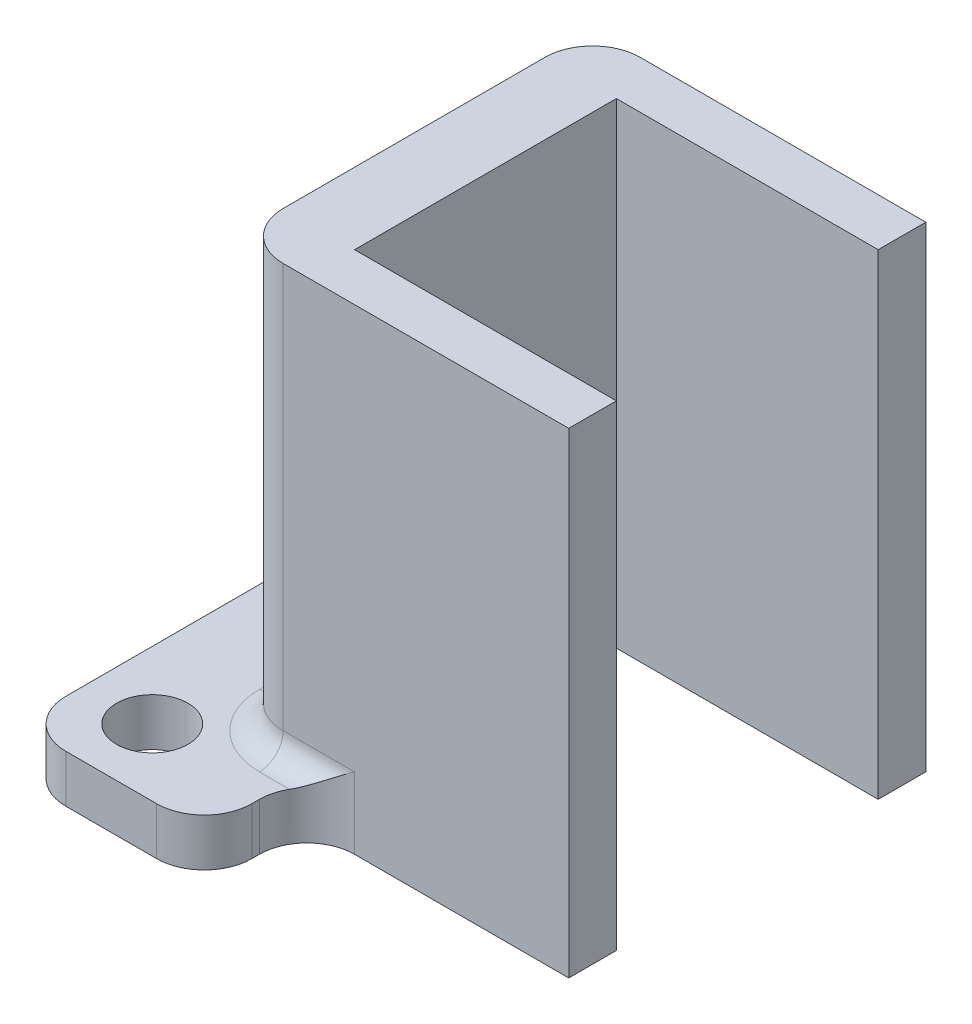
ISO-10303-21;
HEADER;
FILE_DESCRIPTION(('STEP AP214'),'2;1');
FILE_NAME('part.step','',(''),(''),'','','');
FILE_SCHEMA(('AUTOMOTIVE_DESIGN { 1 0 10303 214 1 1 1 1 }'));
ENDSEC;
DATA;
#1=APPLICATION_CONTEXT('core data for automotive mechanical design processes');
#2=APPLICATION_PROTOCOL_DEFINITION('international standard','automotive_design',2000,#1);
#3=PRODUCT_CONTEXT('',#1,'mechanical');
#4=PRODUCT('Part','Part','',(#3));
#5=PRODUCT_RELATED_PRODUCT_CATEGORY('part','',(#4));
#6=PRODUCT_DEFINITION_FORMATION('','',#4);
#7=PRODUCT_DEFINITION_CONTEXT('part definition',#1,'design');
#8=PRODUCT_DEFINITION('design','',#6,#7);
#9=PRODUCT_DEFINITION_SHAPE('','',#8);
#10=(LENGTH_UNIT() NAMED_UNIT(*) SI_UNIT(.MILLI.,.METRE.));
#11=(NAMED_UNIT(*) PLANE_ANGLE_UNIT() SI_UNIT($,.RADIAN.));
#12=(NAMED_UNIT(*) SI_UNIT($,.STERADIAN.) SOLID_ANGLE_UNIT());
#13=UNCERTAINTY_MEASURE_WITH_UNIT(LENGTH_MEASURE(1.E-05),#10,'distance_accuracy_value','');
#14=(GEOMETRIC_REPRESENTATION_CONTEXT(3) GLOBAL_UNCERTAINTY_ASSIGNED_CONTEXT((#13)) GLOBAL_UNIT_ASSIGNED_CONTEXT((#10,
#11,#12)) REPRESENTATION_CONTEXT('',''));
#15=CARTESIAN_POINT('',(0.,0.,0.));
#16=DIRECTION('',(0.,0.,1.));
#17=DIRECTION('',(1.,0.,0.));
#18=AXIS2_PLACEMENT_3D('',#15,#16,#17);
#19=CARTESIAN_POINT('',(0.,2.,0.));
#20=DIRECTION('',(0.,1.,0.));
#21=DIRECTION('',(0.,0.,1.));
#22=AXIS2_PLACEMENT_3D('',#19,#20,#21);
#23=PLANE('',#22);
#24=CARTESIAN_POINT('',(2.,2.,4.));
#25=DIRECTION('',(0.,1.,0.));
#26=DIRECTION('',(0.,0.,1.));
#27=AXIS2_PLACEMENT_3D('',#24,#25,#26);
#28=CIRCLE('',#27,2.);
#29=CARTESIAN_POINT('',(0.,2.,4.));
#30=VERTEX_POINT('',#29);
#31=CARTESIAN_POINT('',(0.267949192431123,2.,3.));
#32=VERTEX_POINT('',#31);
#33=EDGE_CURVE('E376',#30,#32,#28,.F.);
#34=ORIENTED_EDGE('',*,*,#33,.T.);
#35=DIRECTION('',(1.,0.,0.));
#36=VECTOR('',#35,1.);
#37=CARTESIAN_POINT('',(-0.999999999999999,2.,3.));
#38=LINE('',#37,#36);
#39=CARTESIAN_POINT('',(-0.999999999999999,2.,3.));
#40=VERTEX_POINT('',#39);
#41=EDGE_CURVE('E394',#32,#40,#38,.F.);
#42=ORIENTED_EDGE('',*,*,#41,.T.);
#43=CARTESIAN_POINT('',(-1.,2.,0.));
#44=DIRECTION('',(0.,1.,0.));
#45=DIRECTION('',(0.,0.,1.));
#46=AXIS2_PLACEMENT_3D('',#43,#44,#45);
#47=CIRCLE('',#46,3.);
#48=CARTESIAN_POINT('',(-4.,2.,0.));
#49=VERTEX_POINT('',#48);
#50=EDGE_CURVE('E392',#40,#49,#47,.F.);
#51=ORIENTED_EDGE('',*,*,#50,.T.);
#52=DIRECTION('',(0.,0.,-1.));
#53=VECTOR('',#52,1.);
#54=CARTESIAN_POINT('',(-4.,2.,0.));
#55=LINE('',#54,#53);
#56=CARTESIAN_POINT('',(-4.,2.,-11.));
#57=VERTEX_POINT('',#56);
#58=EDGE_CURVE('E386',#49,#57,#55,.T.);
#59=ORIENTED_EDGE('',*,*,#58,.T.);
#60=CARTESIAN_POINT('',(-1.,2.,-11.));
#61=DIRECTION('',(0.,1.,0.));
#62=DIRECTION('',(0.,0.,1.));
#63=AXIS2_PLACEMENT_3D('',#60,#61,#62);
#64=CIRCLE('',#63,3.);
#65=CARTESIAN_POINT('',(-1.,2.,-14.));
#66=VERTEX_POINT('',#65);
#67=EDGE_CURVE('E388',#57,#66,#64,.F.);
#68=ORIENTED_EDGE('',*,*,#67,.T.);
#69=DIRECTION('',(1.,0.,0.));
#70=VECTOR('',#69,1.);
#71=CARTESIAN_POINT('',(0.,2.,-14.));
#72=LINE('',#71,#70);
#73=CARTESIAN_POINT('',(0.267949192431122,2.,-14.));
#74=VERTEX_POINT('',#73);
#75=EDGE_CURVE('E390',#66,#74,#72,.T.);
#76=ORIENTED_EDGE('',*,*,#75,.T.);
#77=CARTESIAN_POINT('',(2.,2.,-15.));
#78=DIRECTION('',(0.,1.,0.));
#79=DIRECTION('',(0.,0.,1.));
#80=AXIS2_PLACEMENT_3D('',#77,#78,#79);
#81=CIRCLE('',#80,2.);
#82=CARTESIAN_POINT('',(0.,2.,-15.));
#83=VERTEX_POINT('',#82);
#84=EDGE_CURVE('E381',#74,#83,#81,.F.);
#85=ORIENTED_EDGE('',*,*,#84,.T.);
#86=DIRECTION('',(0.,0.,1.));
#87=VECTOR('',#86,1.);
#88=CARTESIAN_POINT('',(0.,2.,0.));
#89=LINE('',#88,#87);
#90=CARTESIAN_POINT('',(0.,2.,-15.3158635623537));
#91=VERTEX_POINT('',#90);
#92=EDGE_CURVE('E254',#91,#83,#89,.T.);
#93=ORIENTED_EDGE('',*,*,#92,.F.);
#94=CARTESIAN_POINT('',(-2.,2.,-15.3158635623537));
#95=DIRECTION('',(0.,1.,0.));
#96=DIRECTION('',(0.,0.,1.));
#97=AXIS2_PLACEMENT_3D('',#94,#95,#96);
#98=CIRCLE('',#97,2.);
#99=CARTESIAN_POINT('',(-2.,2.,-17.3158635623537));
#100=VERTEX_POINT('',#99);
#101=EDGE_CURVE('E334',#91,#100,#98,.T.);
#102=ORIENTED_EDGE('',*,*,#101,.T.);
#103=DIRECTION('',(-1.,0.,0.));
#104=VECTOR('',#103,1.);
#105=CARTESIAN_POINT('',(0.,2.,-17.3158635623537));
#106=LINE('',#105,#104);
#107=CARTESIAN_POINT('',(-5.81604711816526,2.,-17.3158635623537));
#108=VERTEX_POINT('',#107);
#109=EDGE_CURVE('E257',#100,#108,#106,.T.);
#110=ORIENTED_EDGE('',*,*,#109,.T.);
#111=CARTESIAN_POINT('',(-5.81604711816526,2.,-15.3158635623537));
#112=DIRECTION('',(0.,1.,0.));
#113=DIRECTION('',(0.,0.,1.));
#114=AXIS2_PLACEMENT_3D('',#111,#112,#113);
#115=CIRCLE('',#114,2.);
#116=CARTESIAN_POINT('',(-7.81604711816526,2.,-15.3158635623537));
#117=VERTEX_POINT('',#116);
#118=EDGE_CURVE('E336',#108,#117,#115,.T.);
#119=ORIENTED_EDGE('',*,*,#118,.T.);
#120=DIRECTION('',(0.,0.,1.));
#121=VECTOR('',#120,1.);
#122=CARTESIAN_POINT('',(-7.81604711816526,2.,0.));
#123=LINE('',#122,#121);
#124=CARTESIAN_POINT('',(-7.81604711816526,2.,4.31586356235365));
#125=VERTEX_POINT('',#124);
#126=EDGE_CURVE('E261',#117,#125,#123,.T.);
#127=ORIENTED_EDGE('',*,*,#126,.T.);
#128=CARTESIAN_POINT('',(-5.81604711816526,2.,4.31586356235365));
#129=DIRECTION('',(0.,1.,0.));
#130=DIRECTION('',(0.,0.,1.));
#131=AXIS2_PLACEMENT_3D('',#128,#129,#130);
#132=CIRCLE('',#131,2.);
#133=CARTESIAN_POINT('',(-5.81604711816526,2.,6.31586356235365));
#134=VERTEX_POINT('',#133);
#135=EDGE_CURVE('E338',#125,#134,#132,.T.);
#136=ORIENTED_EDGE('',*,*,#135,.T.);
#137=DIRECTION('',(-1.,0.,0.));
#138=VECTOR('',#137,1.);
#139=CARTESIAN_POINT('',(0.,2.,6.31586356235365));
#140=LINE('',#139,#138);
#141=CARTESIAN_POINT('',(-2.,2.,6.31586356235365));
#142=VERTEX_POINT('',#141);
#143=EDGE_CURVE('E264',#142,#134,#140,.T.);
#144=ORIENTED_EDGE('',*,*,#143,.F.);
#145=CARTESIAN_POINT('',(-2.,2.,4.31586356235365));
#146=DIRECTION('',(0.,1.,0.));
#147=DIRECTION('',(0.,0.,1.));
#148=AXIS2_PLACEMENT_3D('',#145,#146,#147);
#149=CIRCLE('',#148,2.);
#150=CARTESIAN_POINT('',(0.,2.,4.31586356235365));
#151=VERTEX_POINT('',#150);
#152=EDGE_CURVE('E340',#142,#151,#149,.T.);
#153=ORIENTED_EDGE('',*,*,#152,.T.);
#154=EDGE_CURVE('E258',#30,#151,#89,.T.);
#155=ORIENTED_EDGE('',*,*,#154,.F.);
#156=EDGE_LOOP('',(#34,#42,#51,#59,#68,#76,#85,#93,#102,#110,#119,#127,#136,#144,#153,#155));
#157=FACE_BOUND('',#156,.T.);
#158=CARTESIAN_POINT('',(-5.,2.,3.5));
#159=DIRECTION('',(0.,1.,0.));
#160=DIRECTION('',(0.,0.,1.));
#161=AXIS2_PLACEMENT_3D('',#158,#159,#160);
#162=CIRCLE('',#161,1.5);
#163=CARTESIAN_POINT('',(-5.,2.,5.));
#164=VERTEX_POINT('',#163);
#165=EDGE_CURVE('E267',#164,#164,#162,.T.);
#166=ORIENTED_EDGE('',*,*,#165,.F.);
#167=EDGE_LOOP('',(#166));
#168=FACE_BOUND('',#167,.T.);
#169=CARTESIAN_POINT('',(-5.,2.,-14.5));
#170=DIRECTION('',(0.,1.,0.));
#171=DIRECTION('',(0.,0.,1.));
#172=AXIS2_PLACEMENT_3D('',#169,#170,#171);
#173=CIRCLE('',#172,1.5);
#174=CARTESIAN_POINT('',(-5.,2.,-13.));
#175=VERTEX_POINT('',#174);
#176=EDGE_CURVE('E270',#175,#175,#173,.T.);
#177=ORIENTED_EDGE('',*,*,#176,.F.);
#178=EDGE_LOOP('',(#177));
#179=FACE_BOUND('',#178,.T.);
#180=ADVANCED_FACE('F37',(#157,#168,#179),#23,.T.);
#181=CARTESIAN_POINT('',(0.,2.,0.));
#182=DIRECTION('',(1.,0.,0.));
#183=DIRECTION('',(0.,0.,-1.));
#184=AXIS2_PLACEMENT_3D('',#181,#182,#183);
#185=PLANE('',#184);
#186=ORIENTED_EDGE('',*,*,#154,.T.);
#187=DIRECTION('',(0.,-1.,0.));
#188=VECTOR('',#187,1.);
#189=CARTESIAN_POINT('',(0.,2.,4.31586356235365));
#190=LINE('',#189,#188);
#191=CARTESIAN_POINT('',(0.,0.,4.31586356235365));
#192=VERTEX_POINT('',#191);
#193=EDGE_CURVE('E318',#151,#192,#190,.T.);
#194=ORIENTED_EDGE('',*,*,#193,.T.);
#195=DIRECTION('',(0.,0.,1.));
#196=VECTOR('',#195,1.);
#197=CARTESIAN_POINT('',(0.,0.,0.));
#198=LINE('',#197,#196);
#199=CARTESIAN_POINT('',(0.,0.,4.));
#200=VERTEX_POINT('',#199);
#201=EDGE_CURVE('E253',#200,#192,#198,.T.);
#202=ORIENTED_EDGE('',*,*,#201,.F.);
#203=DIRECTION('',(0.,-1.,0.));
#204=VECTOR('',#203,1.);
#205=CARTESIAN_POINT('',(0.,2.,4.));
#206=LINE('',#205,#204);
#207=EDGE_CURVE('E316',#200,#30,#206,.F.);
#208=ORIENTED_EDGE('',*,*,#207,.T.);
#209=EDGE_LOOP('',(#186,#194,#202,#208));
#210=FACE_BOUND('',#209,.T.);
#211=ADVANCED_FACE('F454',(#210),#185,.T.);
#212=CARTESIAN_POINT('',(0.,2.,2.));
#213=DIRECTION('',(0.,0.,1.));
#214=DIRECTION('',(1.,0.,0.));
#215=AXIS2_PLACEMENT_3D('',#212,#213,#214);
#216=PLANE('',#215);
#217=DIRECTION('',(0.,-1.,0.));
#218=VECTOR('',#217,1.);
#219=CARTESIAN_POINT('',(-0.999999999999999,2.,2.));
#220=LINE('',#219,#218);
#221=CARTESIAN_POINT('',(-0.999999999999999,20.,2.));
#222=VERTEX_POINT('',#221);
#223=CARTESIAN_POINT('',(-0.999999999999999,3.,2.));
#224=VERTEX_POINT('',#223);
#225=EDGE_CURVE('E342',#222,#224,#220,.T.);
#226=ORIENTED_EDGE('',*,*,#225,.T.);
#227=DIRECTION('',(1.,0.,0.));
#228=VECTOR('',#227,1.);
#229=CARTESIAN_POINT('',(2.,3.,2.));
#230=LINE('',#229,#228);
#231=CARTESIAN_POINT('',(2.,3.,2.));
#232=VERTEX_POINT('',#231);
#233=EDGE_CURVE('E383',#224,#232,#230,.T.);
#234=ORIENTED_EDGE('',*,*,#233,.T.);
#235=DIRECTION('',(0.,-1.,0.));
#236=VECTOR('',#235,1.);
#237=CARTESIAN_POINT('',(2.,0.,2.));
#238=LINE('',#237,#236);
#239=CARTESIAN_POINT('',(2.,0.,2.));
#240=VERTEX_POINT('',#239);
#241=EDGE_CURVE('E345',#232,#240,#238,.T.);
#242=ORIENTED_EDGE('',*,*,#241,.T.);
#243=DIRECTION('',(-1.,0.,0.));
#244=VECTOR('',#243,1.);
#245=CARTESIAN_POINT('',(0.,0.,2.));
#246=LINE('',#245,#244);
#247=CARTESIAN_POINT('',(11.,0.,2.));
#248=VERTEX_POINT('',#247);
#249=EDGE_CURVE('E279',#248,#240,#246,.T.);
#250=ORIENTED_EDGE('',*,*,#249,.F.);
#251=DIRECTION('',(0.,-1.,0.));
#252=VECTOR('',#251,1.);
#253=CARTESIAN_POINT('',(11.,2.,2.));
#254=LINE('',#253,#252);
#255=CARTESIAN_POINT('',(11.,20.,2.));
#256=VERTEX_POINT('',#255);
#257=EDGE_CURVE('E314',#256,#248,#254,.T.);
#258=ORIENTED_EDGE('',*,*,#257,.F.);
#259=DIRECTION('',(-1.,0.,0.));
#260=VECTOR('',#259,1.);
#261=CARTESIAN_POINT('',(0.,20.,2.));
#262=LINE('',#261,#260);
#263=EDGE_CURVE('E246',#256,#222,#262,.T.);
#264=ORIENTED_EDGE('',*,*,#263,.T.);
#265=EDGE_LOOP('',(#226,#234,#242,#250,#258,#264));
#266=FACE_BOUND('',#265,.T.);
#267=ADVANCED_FACE('F460',(#266),#216,.T.);
#268=CARTESIAN_POINT('',(11.,2.,0.));
#269=DIRECTION('',(1.,0.,0.));
#270=DIRECTION('',(0.,0.,-1.));
#271=AXIS2_PLACEMENT_3D('',#268,#269,#270);
#272=PLANE('',#271);
#273=DIRECTION('',(0.,0.,1.));
#274=VECTOR('',#273,1.);
#275=CARTESIAN_POINT('',(11.,0.,0.));
#276=LINE('',#275,#274);
#277=CARTESIAN_POINT('',(11.,0.,0.));
#278=VERTEX_POINT('',#277);
#279=EDGE_CURVE('E282',#278,#248,#276,.T.);
#280=ORIENTED_EDGE('',*,*,#279,.F.);
#281=DIRECTION('',(0.,-1.,0.));
#282=VECTOR('',#281,1.);
#283=CARTESIAN_POINT('',(11.,2.,0.));
#284=LINE('',#283,#282);
#285=CARTESIAN_POINT('',(11.,20.,0.));
#286=VERTEX_POINT('',#285);
#287=EDGE_CURVE('E312',#286,#278,#284,.T.);
#288=ORIENTED_EDGE('',*,*,#287,.F.);
#289=DIRECTION('',(0.,0.,1.));
#290=VECTOR('',#289,1.);
#291=CARTESIAN_POINT('',(11.,20.,0.));
#292=LINE('',#291,#290);
#293=EDGE_CURVE('E249',#286,#256,#292,.T.);
#294=ORIENTED_EDGE('',*,*,#293,.T.);
#295=ORIENTED_EDGE('',*,*,#257,.T.);
#296=EDGE_LOOP('',(#280,#288,#294,#295));
#297=FACE_BOUND('',#296,.T.);
#298=ADVANCED_FACE('F509',(#297),#272,.T.);
#299=CARTESIAN_POINT('',(0.,2.,0.));
#300=DIRECTION('',(0.,0.,-1.));
#301=DIRECTION('',(-1.,0.,0.));
#302=AXIS2_PLACEMENT_3D('',#299,#300,#301);
#303=PLANE('',#302);
#304=DIRECTION('',(1.,0.,0.));
#305=VECTOR('',#304,1.);
#306=CARTESIAN_POINT('',(0.,0.,0.));
#307=LINE('',#306,#305);
#308=CARTESIAN_POINT('',(0.,0.,0.));
#309=VERTEX_POINT('',#308);
#310=EDGE_CURVE('E285',#309,#278,#307,.T.);
#311=ORIENTED_EDGE('',*,*,#310,.F.);
#312=DIRECTION('',(0.,-1.,0.));
#313=VECTOR('',#312,1.);
#314=CARTESIAN_POINT('',(0.,2.,0.));
#315=LINE('',#314,#313);
#316=CARTESIAN_POINT('',(0.,20.,0.));
#317=VERTEX_POINT('',#316);
#318=EDGE_CURVE('E220',#317,#309,#315,.T.);
#319=ORIENTED_EDGE('',*,*,#318,.F.);
#320=DIRECTION('',(1.,0.,0.));
#321=VECTOR('',#320,1.);
#322=CARTESIAN_POINT('',(0.,20.,0.));
#323=LINE('',#322,#321);
#324=EDGE_CURVE('E235',#317,#286,#323,.T.);
#325=ORIENTED_EDGE('',*,*,#324,.T.);
#326=ORIENTED_EDGE('',*,*,#287,.T.);
#327=EDGE_LOOP('',(#311,#319,#325,#326));
#328=FACE_BOUND('',#327,.T.);
#329=ADVANCED_FACE('F506',(#328),#303,.T.);
#330=CARTESIAN_POINT('',(0.,2.,0.));
#331=DIRECTION('',(1.,0.,0.));
#332=DIRECTION('',(0.,0.,-1.));
#333=AXIS2_PLACEMENT_3D('',#330,#331,#332);
#334=PLANE('',#333);
#335=DIRECTION('',(0.,0.,1.));
#336=VECTOR('',#335,1.);
#337=CARTESIAN_POINT('',(0.,0.,0.));
#338=LINE('',#337,#336);
#339=CARTESIAN_POINT('',(0.,0.,-11.));
#340=VERTEX_POINT('',#339);
#341=EDGE_CURVE('E216',#340,#309,#338,.T.);
#342=ORIENTED_EDGE('',*,*,#341,.F.);
#343=DIRECTION('',(0.,-1.,0.));
#344=VECTOR('',#343,1.);
#345=CARTESIAN_POINT('',(0.,2.,-11.));
#346=LINE('',#345,#344);
#347=CARTESIAN_POINT('',(0.,20.,-11.));
#348=VERTEX_POINT('',#347);
#349=EDGE_CURVE('E209',#348,#340,#346,.T.);
#350=ORIENTED_EDGE('',*,*,#349,.F.);
#351=DIRECTION('',(0.,0.,1.));
#352=VECTOR('',#351,1.);
#353=CARTESIAN_POINT('',(0.,20.,0.));
#354=LINE('',#353,#352);
#355=EDGE_CURVE('E213',#348,#317,#354,.T.);
#356=ORIENTED_EDGE('',*,*,#355,.T.);
#357=ORIENTED_EDGE('',*,*,#318,.T.);
#358=EDGE_LOOP('',(#342,#350,#356,#357));
#359=FACE_BOUND('',#358,.T.);
#360=ADVANCED_FACE('F211',(#359),#334,.T.);
#361=CARTESIAN_POINT('',(0.,2.,-11.));
#362=DIRECTION('',(0.,0.,-1.));
#363=DIRECTION('',(-1.,0.,0.));
#364=AXIS2_PLACEMENT_3D('',#361,#362,#363);
#365=PLANE('',#364);
#366=DIRECTION('',(1.,0.,0.));
#367=VECTOR('',#366,1.);
#368=CARTESIAN_POINT('',(0.,0.,-11.));
#369=LINE('',#368,#367);
#370=CARTESIAN_POINT('',(11.,0.,-11.));
#371=VERTEX_POINT('',#370);
#372=EDGE_CURVE('E289',#340,#371,#369,.T.);
#373=ORIENTED_EDGE('',*,*,#372,.T.);
#374=DIRECTION('',(0.,-1.,0.));
#375=VECTOR('',#374,1.);
#376=CARTESIAN_POINT('',(11.,2.,-11.));
#377=LINE('',#376,#375);
#378=CARTESIAN_POINT('',(11.,20.,-11.));
#379=VERTEX_POINT('',#378);
#380=EDGE_CURVE('E221',#379,#371,#377,.T.);
#381=ORIENTED_EDGE('',*,*,#380,.F.);
#382=DIRECTION('',(1.,0.,0.));
#383=VECTOR('',#382,1.);
#384=CARTESIAN_POINT('',(0.,20.,-11.));
#385=LINE('',#384,#383);
#386=EDGE_CURVE('E224',#348,#379,#385,.T.);
#387=ORIENTED_EDGE('',*,*,#386,.F.);
#388=ORIENTED_EDGE('',*,*,#349,.T.);
#389=EDGE_LOOP('',(#373,#381,#387,#388));
#390=FACE_BOUND('',#389,.T.);
#391=ADVANCED_FACE('F225',(#390),#365,.F.);
#392=CARTESIAN_POINT('',(11.,2.,0.));
#393=DIRECTION('',(1.,0.,0.));
#394=DIRECTION('',(0.,0.,-1.));
#395=AXIS2_PLACEMENT_3D('',#392,#393,#394);
#396=PLANE('',#395);
#397=DIRECTION('',(0.,0.,1.));
#398=VECTOR('',#397,1.);
#399=CARTESIAN_POINT('',(11.,0.,0.));
#400=LINE('',#399,#398);
#401=CARTESIAN_POINT('',(11.,0.,-13.));
#402=VERTEX_POINT('',#401);
#403=EDGE_CURVE('E291',#402,#371,#400,.T.);
#404=ORIENTED_EDGE('',*,*,#403,.F.);
#405=DIRECTION('',(0.,-1.,0.));
#406=VECTOR('',#405,1.);
#407=CARTESIAN_POINT('',(11.,2.,-13.));
#408=LINE('',#407,#406);
#409=CARTESIAN_POINT('',(11.,20.,-13.));
#410=VERTEX_POINT('',#409);
#411=EDGE_CURVE('E273',#410,#402,#408,.T.);
#412=ORIENTED_EDGE('',*,*,#411,.F.);
#413=DIRECTION('',(0.,0.,1.));
#414=VECTOR('',#413,1.);
#415=CARTESIAN_POINT('',(11.,20.,0.));
#416=LINE('',#415,#414);
#417=EDGE_CURVE('E229',#410,#379,#416,.T.);
#418=ORIENTED_EDGE('',*,*,#417,.T.);
#419=ORIENTED_EDGE('',*,*,#380,.T.);
#420=EDGE_LOOP('',(#404,#412,#418,#419));
#421=FACE_BOUND('',#420,.T.);
#422=ADVANCED_FACE('F498',(#421),#396,.T.);
#423=CARTESIAN_POINT('',(0.,2.,-13.));
#424=DIRECTION('',(0.,0.,1.));
#425=DIRECTION('',(1.,0.,0.));
#426=AXIS2_PLACEMENT_3D('',#423,#424,#425);
#427=PLANE('',#426);
#428=DIRECTION('',(0.,-1.,0.));
#429=VECTOR('',#428,1.);
#430=CARTESIAN_POINT('',(2.,2.,-13.));
#431=LINE('',#430,#429);
#432=CARTESIAN_POINT('',(2.,0.,-13.));
#433=VERTEX_POINT('',#432);
#434=CARTESIAN_POINT('',(2.,3.,-13.));
#435=VERTEX_POINT('',#434);
#436=EDGE_CURVE('E63',#433,#435,#431,.F.);
#437=ORIENTED_EDGE('',*,*,#436,.T.);
#438=DIRECTION('',(1.,0.,0.));
#439=VECTOR('',#438,1.);
#440=CARTESIAN_POINT('',(0.,3.,-13.));
#441=LINE('',#440,#439);
#442=CARTESIAN_POINT('',(-1.,3.,-13.));
#443=VERTEX_POINT('',#442);
#444=EDGE_CURVE('E398',#435,#443,#441,.F.);
#445=ORIENTED_EDGE('',*,*,#444,.T.);
#446=DIRECTION('',(0.,-1.,0.));
#447=VECTOR('',#446,1.);
#448=CARTESIAN_POINT('',(-1.,2.,-13.));
#449=LINE('',#448,#447);
#450=CARTESIAN_POINT('',(-1.,20.,-13.));
#451=VERTEX_POINT('',#450);
#452=EDGE_CURVE('E363',#443,#451,#449,.F.);
#453=ORIENTED_EDGE('',*,*,#452,.T.);
#454=DIRECTION('',(-1.,0.,0.));
#455=VECTOR('',#454,1.);
#456=CARTESIAN_POINT('',(0.,20.,-13.));
#457=LINE('',#456,#455);
#458=EDGE_CURVE('E241',#410,#451,#457,.T.);
#459=ORIENTED_EDGE('',*,*,#458,.F.);
#460=ORIENTED_EDGE('',*,*,#411,.T.);
#461=DIRECTION('',(-1.,0.,0.));
#462=VECTOR('',#461,1.);
#463=CARTESIAN_POINT('',(0.,0.,-13.));
#464=LINE('',#463,#462);
#465=EDGE_CURVE('E278',#402,#433,#464,.T.);
#466=ORIENTED_EDGE('',*,*,#465,.T.);
#467=EDGE_LOOP('',(#437,#445,#453,#459,#460,#466));
#468=FACE_BOUND('',#467,.T.);
#469=ADVANCED_FACE('F494',(#468),#427,.F.);
#470=CARTESIAN_POINT('',(0.,0.,-15.3158635623537));
#471=VERTEX_POINT('',#470);
#472=CARTESIAN_POINT('',(0.,0.,-15.));
#473=VERTEX_POINT('',#472);
#474=EDGE_CURVE('E274',#471,#473,#198,.T.);
#475=ORIENTED_EDGE('',*,*,#474,.F.);
#476=DIRECTION('',(0.,-1.,0.));
#477=VECTOR('',#476,1.);
#478=CARTESIAN_POINT('',(0.,2.,-15.3158635623537));
#479=LINE('',#478,#477);
#480=EDGE_CURVE('E361',#471,#91,#479,.F.);
#481=ORIENTED_EDGE('',*,*,#480,.T.);
#482=ORIENTED_EDGE('',*,*,#92,.T.);
#483=DIRECTION('',(0.,-1.,0.));
#484=VECTOR('',#483,1.);
#485=CARTESIAN_POINT('',(0.,2.,-15.));
#486=LINE('',#485,#484);
#487=EDGE_CURVE('E358',#83,#473,#486,.T.);
#488=ORIENTED_EDGE('',*,*,#487,.T.);
#489=EDGE_LOOP('',(#475,#481,#482,#488));
#490=FACE_BOUND('',#489,.T.);
#491=ADVANCED_FACE('F463',(#490),#185,.T.);
#492=CARTESIAN_POINT('',(0.,2.,-17.3158635623537));
#493=DIRECTION('',(0.,0.,1.));
#494=DIRECTION('',(1.,0.,0.));
#495=AXIS2_PLACEMENT_3D('',#492,#493,#494);
#496=PLANE('',#495);
#497=DIRECTION('',(-1.,0.,0.));
#498=VECTOR('',#497,1.);
#499=CARTESIAN_POINT('',(0.,0.,-17.3158635623537));
#500=LINE('',#499,#498);
#501=CARTESIAN_POINT('',(-2.,0.,-17.3158635623537));
#502=VERTEX_POINT('',#501);
#503=CARTESIAN_POINT('',(-5.81604711816526,0.,-17.3158635623537));
#504=VERTEX_POINT('',#503);
#505=EDGE_CURVE('E277',#502,#504,#500,.T.);
#506=ORIENTED_EDGE('',*,*,#505,.T.);
#507=DIRECTION('',(0.,-1.,0.));
#508=VECTOR('',#507,1.);
#509=CARTESIAN_POINT('',(-5.81604711816526,2.,-17.3158635623537));
#510=LINE('',#509,#508);
#511=EDGE_CURVE('E356',#504,#108,#510,.F.);
#512=ORIENTED_EDGE('',*,*,#511,.T.);
#513=ORIENTED_EDGE('',*,*,#109,.F.);
#514=DIRECTION('',(0.,-1.,0.));
#515=VECTOR('',#514,1.);
#516=CARTESIAN_POINT('',(-2.,0.,-17.3158635623537));
#517=LINE('',#516,#515);
#518=EDGE_CURVE('E353',#100,#502,#517,.T.);
#519=ORIENTED_EDGE('',*,*,#518,.T.);
#520=EDGE_LOOP('',(#506,#512,#513,#519));
#521=FACE_BOUND('',#520,.T.);
#522=ADVANCED_FACE('F488',(#521),#496,.F.);
#523=CARTESIAN_POINT('',(-7.81604711816526,2.,0.));
#524=DIRECTION('',(1.,0.,0.));
#525=DIRECTION('',(0.,0.,-1.));
#526=AXIS2_PLACEMENT_3D('',#523,#524,#525);
#527=PLANE('',#526);
#528=DIRECTION('',(0.,0.,1.));
#529=VECTOR('',#528,1.);
#530=CARTESIAN_POINT('',(-7.81604711816526,0.,0.));
#531=LINE('',#530,#529);
#532=CARTESIAN_POINT('',(-7.81604711816526,0.,-15.3158635623537));
#533=VERTEX_POINT('',#532);
#534=CARTESIAN_POINT('',(-7.81604711816526,0.,4.31586356235365));
#535=VERTEX_POINT('',#534);
#536=EDGE_CURVE('E297',#533,#535,#531,.T.);
#537=ORIENTED_EDGE('',*,*,#536,.T.);
#538=DIRECTION('',(0.,-1.,0.));
#539=VECTOR('',#538,1.);
#540=CARTESIAN_POINT('',(-7.81604711816526,2.,4.31586356235365));
#541=LINE('',#540,#539);
#542=EDGE_CURVE('E351',#535,#125,#541,.F.);
#543=ORIENTED_EDGE('',*,*,#542,.T.);
#544=ORIENTED_EDGE('',*,*,#126,.F.);
#545=DIRECTION('',(0.,-1.,0.));
#546=VECTOR('',#545,1.);
#547=CARTESIAN_POINT('',(-7.81604711816526,2.,-15.3158635623537));
#548=LINE('',#547,#546);
#549=EDGE_CURVE('E348',#117,#533,#548,.T.);
#550=ORIENTED_EDGE('',*,*,#549,.T.);
#551=EDGE_LOOP('',(#537,#543,#544,#550));
#552=FACE_BOUND('',#551,.T.);
#553=ADVANCED_FACE('F481',(#552),#527,.F.);
#554=CARTESIAN_POINT('',(-5.,2.,3.5));
#555=DIRECTION('',(0.,-1.,0.));
#556=DIRECTION('',(0.,0.,-1.));
#557=AXIS2_PLACEMENT_3D('',#554,#555,#556);
#558=CYLINDRICAL_SURFACE('',#557,1.5);
#559=ORIENTED_EDGE('',*,*,#165,.T.);
#560=EDGE_LOOP('',(#559));
#561=FACE_BOUND('',#560,.T.);
#562=CARTESIAN_POINT('',(-5.,0.,3.5));
#563=DIRECTION('',(0.,1.,0.));
#564=DIRECTION('',(0.,0.,1.));
#565=AXIS2_PLACEMENT_3D('',#562,#563,#564);
#566=CIRCLE('',#565,1.5);
#567=CARTESIAN_POINT('',(-5.,0.,5.));
#568=VERTEX_POINT('',#567);
#569=EDGE_CURVE('E303',#568,#568,#566,.T.);
#570=ORIENTED_EDGE('',*,*,#569,.F.);
#571=EDGE_LOOP('',(#570));
#572=FACE_BOUND('',#571,.T.);
#573=ADVANCED_FACE('F478',(#561,#572),#558,.F.);
#574=CARTESIAN_POINT('',(0.,2.,6.31586356235365));
#575=DIRECTION('',(0.,0.,1.));
#576=DIRECTION('',(1.,0.,0.));
#577=AXIS2_PLACEMENT_3D('',#574,#575,#576);
#578=PLANE('',#577);
#579=DIRECTION('',(-1.,0.,0.));
#580=VECTOR('',#579,1.);
#581=CARTESIAN_POINT('',(0.,0.,6.31586356235365));
#582=LINE('',#581,#580);
#583=CARTESIAN_POINT('',(-2.,0.,6.31586356235365));
#584=VERTEX_POINT('',#583);
#585=CARTESIAN_POINT('',(-5.81604711816526,0.,6.31586356235365));
#586=VERTEX_POINT('',#585);
#587=EDGE_CURVE('E300',#584,#586,#582,.T.);
#588=ORIENTED_EDGE('',*,*,#587,.F.);
#589=DIRECTION('',(0.,-1.,0.));
#590=VECTOR('',#589,1.);
#591=CARTESIAN_POINT('',(-2.,2.,6.31586356235365));
#592=LINE('',#591,#590);
#593=EDGE_CURVE('E332',#584,#142,#592,.F.);
#594=ORIENTED_EDGE('',*,*,#593,.T.);
#595=ORIENTED_EDGE('',*,*,#143,.T.);
#596=DIRECTION('',(0.,-1.,0.));
#597=VECTOR('',#596,1.);
#598=CARTESIAN_POINT('',(-5.81604711816526,0.,6.31586356235365));
#599=LINE('',#598,#597);
#600=EDGE_CURVE('E329',#134,#586,#599,.T.);
#601=ORIENTED_EDGE('',*,*,#600,.T.);
#602=EDGE_LOOP('',(#588,#594,#595,#601));
#603=FACE_BOUND('',#602,.T.);
#604=ADVANCED_FACE('F476',(#603),#578,.T.);
#605=CARTESIAN_POINT('',(-5.,2.,-14.5));
#606=DIRECTION('',(0.,-1.,0.));
#607=DIRECTION('',(0.,0.,-1.));
#608=AXIS2_PLACEMENT_3D('',#605,#606,#607);
#609=CYLINDRICAL_SURFACE('',#608,1.5);
#610=ORIENTED_EDGE('',*,*,#176,.T.);
#611=EDGE_LOOP('',(#610));
#612=FACE_BOUND('',#611,.T.);
#613=CARTESIAN_POINT('',(-5.,0.,-14.5));
#614=DIRECTION('',(0.,1.,0.));
#615=DIRECTION('',(0.,0.,1.));
#616=AXIS2_PLACEMENT_3D('',#613,#614,#615);
#617=CIRCLE('',#616,1.5);
#618=CARTESIAN_POINT('',(-5.,0.,-13.));
#619=VERTEX_POINT('',#618);
#620=EDGE_CURVE('E306',#619,#619,#617,.T.);
#621=ORIENTED_EDGE('',*,*,#620,.F.);
#622=EDGE_LOOP('',(#621));
#623=FACE_BOUND('',#622,.T.);
#624=ADVANCED_FACE('F472',(#612,#623),#609,.F.);
#625=CARTESIAN_POINT('',(0.,0.,0.));
#626=DIRECTION('',(0.,1.,0.));
#627=DIRECTION('',(0.,0.,1.));
#628=AXIS2_PLACEMENT_3D('',#625,#626,#627);
#629=PLANE('',#628);
#630=ORIENTED_EDGE('',*,*,#201,.T.);
#631=CARTESIAN_POINT('',(-2.,0.,4.31586356235365));
#632=DIRECTION('',(0.,1.,0.));
#633=DIRECTION('',(0.,0.,1.));
#634=AXIS2_PLACEMENT_3D('',#631,#632,#633);
#635=CIRCLE('',#634,2.);
#636=EDGE_CURVE('E327',#192,#584,#635,.F.);
#637=ORIENTED_EDGE('',*,*,#636,.T.);
#638=ORIENTED_EDGE('',*,*,#587,.T.);
#639=CARTESIAN_POINT('',(-5.81604711816526,0.,4.31586356235365));
#640=DIRECTION('',(0.,1.,0.));
#641=DIRECTION('',(0.,0.,1.));
#642=AXIS2_PLACEMENT_3D('',#639,#640,#641);
#643=CIRCLE('',#642,2.);
#644=EDGE_CURVE('E325',#586,#535,#643,.F.);
#645=ORIENTED_EDGE('',*,*,#644,.T.);
#646=ORIENTED_EDGE('',*,*,#536,.F.);
#647=CARTESIAN_POINT('',(-5.81604711816526,0.,-15.3158635623537));
#648=DIRECTION('',(0.,1.,0.));
#649=DIRECTION('',(0.,0.,1.));
#650=AXIS2_PLACEMENT_3D('',#647,#648,#649);
#651=CIRCLE('',#650,2.);
#652=EDGE_CURVE('E323',#533,#504,#651,.F.);
#653=ORIENTED_EDGE('',*,*,#652,.T.);
#654=ORIENTED_EDGE('',*,*,#505,.F.);
#655=CARTESIAN_POINT('',(-2.,0.,-15.3158635623537));
#656=DIRECTION('',(0.,1.,0.));
#657=DIRECTION('',(0.,0.,1.));
#658=AXIS2_PLACEMENT_3D('',#655,#656,#657);
#659=CIRCLE('',#658,2.);
#660=EDGE_CURVE('E321',#502,#471,#659,.F.);
#661=ORIENTED_EDGE('',*,*,#660,.T.);
#662=ORIENTED_EDGE('',*,*,#474,.T.);
#663=CARTESIAN_POINT('',(2.,0.,-15.));
#664=DIRECTION('',(0.,1.,0.));
#665=DIRECTION('',(0.,0.,1.));
#666=AXIS2_PLACEMENT_3D('',#663,#664,#665);
#667=CIRCLE('',#666,2.);
#668=EDGE_CURVE('E379',#473,#433,#667,.T.);
#669=ORIENTED_EDGE('',*,*,#668,.T.);
#670=ORIENTED_EDGE('',*,*,#465,.F.);
#671=ORIENTED_EDGE('',*,*,#403,.T.);
#672=ORIENTED_EDGE('',*,*,#372,.F.);
#673=ORIENTED_EDGE('',*,*,#341,.T.);
#674=ORIENTED_EDGE('',*,*,#310,.T.);
#675=ORIENTED_EDGE('',*,*,#279,.T.);
#676=ORIENTED_EDGE('',*,*,#249,.T.);
#677=CARTESIAN_POINT('',(2.,0.,4.));
#678=DIRECTION('',(0.,1.,0.));
#679=DIRECTION('',(0.,0.,1.));
#680=AXIS2_PLACEMENT_3D('',#677,#678,#679);
#681=CIRCLE('',#680,2.);
#682=EDGE_CURVE('E374',#240,#200,#681,.T.);
#683=ORIENTED_EDGE('',*,*,#682,.T.);
#684=EDGE_LOOP('',(#630,#637,#638,#645,#646,#653,#654,#661,#662,#669,#670,#671,#672,#673,#674,
#675,#676,#683));
#685=FACE_BOUND('',#684,.T.);
#686=ORIENTED_EDGE('',*,*,#620,.T.);
#687=EDGE_LOOP('',(#686));
#688=FACE_BOUND('',#687,.T.);
#689=ORIENTED_EDGE('',*,*,#569,.T.);
#690=EDGE_LOOP('',(#689));
#691=FACE_BOUND('',#690,.T.);
#692=ADVANCED_FACE('F469',(#685,#688,#691),#629,.F.);
#693=CARTESIAN_POINT('',(-3.,20.,0.));
#694=DIRECTION('',(1.,0.,0.));
#695=DIRECTION('',(0.,0.,-1.));
#696=AXIS2_PLACEMENT_3D('',#693,#694,#695);
#697=PLANE('',#696);
#698=DIRECTION('',(0.,-1.,0.));
#699=VECTOR('',#698,1.);
#700=CARTESIAN_POINT('',(-3.,20.,-11.));
#701=LINE('',#700,#699);
#702=CARTESIAN_POINT('',(-3.,20.,-11.));
#703=VERTEX_POINT('',#702);
#704=CARTESIAN_POINT('',(-3.,3.,-11.));
#705=VERTEX_POINT('',#704);
#706=EDGE_CURVE('E366',#703,#705,#701,.T.);
#707=ORIENTED_EDGE('',*,*,#706,.T.);
#708=DIRECTION('',(0.,0.,-1.));
#709=VECTOR('',#708,1.);
#710=CARTESIAN_POINT('',(-3.,3.,0.));
#711=LINE('',#710,#709);
#712=CARTESIAN_POINT('',(-3.,3.,0.));
#713=VERTEX_POINT('',#712);
#714=EDGE_CURVE('E401',#705,#713,#711,.F.);
#715=ORIENTED_EDGE('',*,*,#714,.T.);
#716=DIRECTION('',(0.,-1.,0.));
#717=VECTOR('',#716,1.);
#718=CARTESIAN_POINT('',(-3.,20.,0.));
#719=LINE('',#718,#717);
#720=CARTESIAN_POINT('',(-3.,20.,0.));
#721=VERTEX_POINT('',#720);
#722=EDGE_CURVE('E368',#713,#721,#719,.F.);
#723=ORIENTED_EDGE('',*,*,#722,.T.);
#724=DIRECTION('',(0.,0.,1.));
#725=VECTOR('',#724,1.);
#726=CARTESIAN_POINT('',(-3.,20.,0.));
#727=LINE('',#726,#725);
#728=EDGE_CURVE('E244',#703,#721,#727,.T.);
#729=ORIENTED_EDGE('',*,*,#728,.F.);
#730=EDGE_LOOP('',(#707,#715,#723,#729));
#731=FACE_BOUND('',#730,.T.);
#732=ADVANCED_FACE('F467',(#731),#697,.F.);
#733=CARTESIAN_POINT('',(0.,20.,0.));
#734=DIRECTION('',(0.,1.,0.));
#735=DIRECTION('',(0.,0.,1.));
#736=AXIS2_PLACEMENT_3D('',#733,#734,#735);
#737=PLANE('',#736);
#738=ORIENTED_EDGE('',*,*,#728,.T.);
#739=CARTESIAN_POINT('',(-1.,20.,0.));
#740=DIRECTION('',(0.,1.,0.));
#741=DIRECTION('',(0.,0.,1.));
#742=AXIS2_PLACEMENT_3D('',#739,#740,#741);
#743=CIRCLE('',#742,2.);
#744=EDGE_CURVE('E372',#721,#222,#743,.T.);
#745=ORIENTED_EDGE('',*,*,#744,.T.);
#746=ORIENTED_EDGE('',*,*,#263,.F.);
#747=ORIENTED_EDGE('',*,*,#293,.F.);
#748=ORIENTED_EDGE('',*,*,#324,.F.);
#749=ORIENTED_EDGE('',*,*,#355,.F.);
#750=ORIENTED_EDGE('',*,*,#386,.T.);
#751=ORIENTED_EDGE('',*,*,#417,.F.);
#752=ORIENTED_EDGE('',*,*,#458,.T.);
#753=CARTESIAN_POINT('',(-1.,20.,-11.));
#754=DIRECTION('',(0.,1.,0.));
#755=DIRECTION('',(0.,0.,1.));
#756=AXIS2_PLACEMENT_3D('',#753,#754,#755);
#757=CIRCLE('',#756,2.);
#758=EDGE_CURVE('E370',#451,#703,#757,.T.);
#759=ORIENTED_EDGE('',*,*,#758,.T.);
#760=EDGE_LOOP('',(#738,#745,#746,#747,#748,#749,#750,#751,#752,#759));
#761=FACE_BOUND('',#760,.T.);
#762=ADVANCED_FACE('F232',(#761),#737,.T.);
#763=CARTESIAN_POINT('',(-2.,2.,4.31586356235365));
#764=DIRECTION('',(0.,-1.,0.));
#765=DIRECTION('',(0.,0.,-1.));
#766=AXIS2_PLACEMENT_3D('',#763,#764,#765);
#767=CYLINDRICAL_SURFACE('',#766,2.);
#768=ORIENTED_EDGE('',*,*,#152,.F.);
#769=ORIENTED_EDGE('',*,*,#593,.F.);
#770=ORIENTED_EDGE('',*,*,#636,.F.);
#771=ORIENTED_EDGE('',*,*,#193,.F.);
#772=EDGE_LOOP('',(#768,#769,#770,#771));
#773=FACE_BOUND('',#772,.T.);
#774=ADVANCED_FACE('F425',(#773),#767,.T.);
#775=CARTESIAN_POINT('',(2.,2.,4.));
#776=DIRECTION('',(0.,1.,0.));
#777=DIRECTION('',(0.,0.,1.));
#778=AXIS2_PLACEMENT_3D('',#775,#776,#777);
#779=CYLINDRICAL_SURFACE('',#778,2.);
#780=ORIENTED_EDGE('',*,*,#33,.F.);
#781=ORIENTED_EDGE('',*,*,#207,.F.);
#782=ORIENTED_EDGE('',*,*,#682,.F.);
#783=ORIENTED_EDGE('',*,*,#241,.F.);
#784=CARTESIAN_POINT('',(0.267949192431123,2.,3.));
#785=CARTESIAN_POINT('',(0.289561190776836,1.99999980568836,2.96254044047365));
#786=CARTESIAN_POINT('',(0.312384961983148,2.00210319796198,2.92583917864711));
#787=CARTESIAN_POINT('',(0.36009172100629,2.01001340764259,2.8543435632005));
#788=CARTESIAN_POINT('',(0.38496935201581,2.01581084038911,2.81954461931416));
#789=CARTESIAN_POINT('',(0.436190401355603,2.03051235919617,2.75249844515593));
#790=CARTESIAN_POINT('',(0.462510034044765,2.03937426984246,2.7202235168443));
#791=CARTESIAN_POINT('',(0.51665438584139,2.0597852158221,2.65783971793181));
#792=CARTESIAN_POINT('',(0.544480202464288,2.07133623142663,2.62773246511539));
#793=CARTESIAN_POINT('',(0.640646849209345,2.11423276751056,2.52980188192177));
#794=CARTESIAN_POINT('',(0.711980651133047,2.15092150342508,2.46717437431735));
#795=CARTESIAN_POINT('',(0.859636260521939,2.23318766839412,2.35431082904296));
#796=CARTESIAN_POINT('',(0.935985662300234,2.27881758821575,2.30415214096292));
#797=CARTESIAN_POINT('',(1.12339927291762,2.39566540445562,2.19794475890172));
#798=CARTESIAN_POINT('',(1.23599063977577,2.46975815567167,2.1477495749302));
#799=CARTESIAN_POINT('',(1.46410128882734,2.62397939495336,2.06936277484821));
#800=CARTESIAN_POINT('',(1.57961658619769,2.70409993406217,2.04114271871491));
#801=CARTESIAN_POINT('',(1.79447174018607,2.85468356114963,2.00809073030031));
#802=CARTESIAN_POINT('',(1.89362557206042,2.92478225234832,2.00037489576334));
#803=CARTESIAN_POINT('',(1.99513140492163,2.99655738388488,2.00000444910877));
#804=CARTESIAN_POINT('',(1.99756573151131,2.99827871283064,2.00000000518405));
#805=CARTESIAN_POINT('',(2.,3.,2.));
#806=B_SPLINE_CURVE_WITH_KNOTS('',3,(#784,#785,#786,#787,#788,#789,#790,#791,#792,#793,#794,
#795,#796,#797,#798,#799,#800,#801,#802,#803,#804,#805),.UNSPECIFIED.,.F.,.F.,(4,2,2,2,2,2,2,2,
2,2,4),(0.,0.129592295294573,0.258856668652756,0.3864085092684,0.51405457852999,
0.817592410147232,1.1229686971365,1.55212503753217,1.98072504008937,2.34472916750578,
2.35367344935465),.UNSPECIFIED.);
#807=EDGE_CURVE('E47',#232,#32,#806,.F.);
#808=ORIENTED_EDGE('',*,*,#807,.T.);
#809=EDGE_LOOP('',(#780,#781,#782,#783,#808));
#810=FACE_BOUND('',#809,.T.);
#811=ADVANCED_FACE('F419',(#810),#779,.F.);
#812=CARTESIAN_POINT('',(-5.81604711816526,2.,4.31586356235365));
#813=DIRECTION('',(0.,1.,0.));
#814=DIRECTION('',(0.,0.,1.));
#815=AXIS2_PLACEMENT_3D('',#812,#813,#814);
#816=CYLINDRICAL_SURFACE('',#815,2.);
#817=ORIENTED_EDGE('',*,*,#135,.F.);
#818=ORIENTED_EDGE('',*,*,#542,.F.);
#819=ORIENTED_EDGE('',*,*,#644,.F.);
#820=ORIENTED_EDGE('',*,*,#600,.F.);
#821=EDGE_LOOP('',(#817,#818,#819,#820));
#822=FACE_BOUND('',#821,.T.);
#823=ADVANCED_FACE('F424',(#822),#816,.T.);
#824=CARTESIAN_POINT('',(-5.81604711816526,2.,-15.3158635623537));
#825=DIRECTION('',(0.,-1.,0.));
#826=DIRECTION('',(0.,0.,-1.));
#827=AXIS2_PLACEMENT_3D('',#824,#825,#826);
#828=CYLINDRICAL_SURFACE('',#827,2.);
#829=ORIENTED_EDGE('',*,*,#118,.F.);
#830=ORIENTED_EDGE('',*,*,#511,.F.);
#831=ORIENTED_EDGE('',*,*,#652,.F.);
#832=ORIENTED_EDGE('',*,*,#549,.F.);
#833=EDGE_LOOP('',(#829,#830,#831,#832));
#834=FACE_BOUND('',#833,.T.);
#835=ADVANCED_FACE('F430',(#834),#828,.T.);
#836=CARTESIAN_POINT('',(-2.,2.,-15.3158635623537));
#837=DIRECTION('',(0.,1.,0.));
#838=DIRECTION('',(0.,0.,1.));
#839=AXIS2_PLACEMENT_3D('',#836,#837,#838);
#840=CYLINDRICAL_SURFACE('',#839,2.);
#841=ORIENTED_EDGE('',*,*,#101,.F.);
#842=ORIENTED_EDGE('',*,*,#480,.F.);
#843=ORIENTED_EDGE('',*,*,#660,.F.);
#844=ORIENTED_EDGE('',*,*,#518,.F.);
#845=EDGE_LOOP('',(#841,#842,#843,#844));
#846=FACE_BOUND('',#845,.T.);
#847=ADVANCED_FACE('F434',(#846),#840,.T.);
#848=CARTESIAN_POINT('',(2.,2.,-15.));
#849=DIRECTION('',(0.,-1.,0.));
#850=DIRECTION('',(0.,0.,-1.));
#851=AXIS2_PLACEMENT_3D('',#848,#849,#850);
#852=CYLINDRICAL_SURFACE('',#851,2.);
#853=ORIENTED_EDGE('',*,*,#84,.F.);
#854=CARTESIAN_POINT('',(0.267949192431123,2.,-14.));
#855=CARTESIAN_POINT('',(0.289561190776837,1.99999980568836,-13.9625404404736));
#856=CARTESIAN_POINT('',(0.312384961983152,2.00210319796198,-13.9258391786471));
#857=CARTESIAN_POINT('',(0.360091721006299,2.01001340764259,-13.8543435632005));
#858=CARTESIAN_POINT('',(0.384969352015822,2.01581084038911,-13.8195446193141));
#859=CARTESIAN_POINT('',(0.436190401355615,2.03051235919617,-13.7524984451559));
#860=CARTESIAN_POINT('',(0.462510034044775,2.03937426984246,-13.7202235168443));
#861=CARTESIAN_POINT('',(0.516654385841395,2.0597852158221,-13.6578397179318));
#862=CARTESIAN_POINT('',(0.544480202464291,2.07133623142663,-13.6277324651154));
#863=CARTESIAN_POINT('',(0.64064684920934,2.11423276751056,-13.5298018819218));
#864=CARTESIAN_POINT('',(0.711980651133034,2.15092150342509,-13.4671743743173));
#865=CARTESIAN_POINT('',(0.859636260521935,2.23318766839411,-13.354310829043));
#866=CARTESIAN_POINT('',(0.935985662300246,2.27881758821573,-13.3041521409629));
#867=CARTESIAN_POINT('',(1.1233992729176,2.39566540445565,-13.1979447589017));
#868=CARTESIAN_POINT('',(1.23599063977567,2.46975815567183,-13.1477495749302));
#869=CARTESIAN_POINT('',(1.46410128882746,2.62397939495321,-13.0693627748482));
#870=CARTESIAN_POINT('',(1.57961658619808,2.70409993406161,-13.0411427187149));
#871=CARTESIAN_POINT('',(1.79447174018573,2.85468356115011,-13.0080907303003));
#872=CARTESIAN_POINT('',(1.89362557205924,2.92478225234998,-13.0003748957633));
#873=CARTESIAN_POINT('',(1.99513140492158,2.99655738388496,-13.0000044491088));
#874=CARTESIAN_POINT('',(1.99756573151128,2.99827871283068,-13.000000005184));
#875=CARTESIAN_POINT('',(2.,3.,-13.));
#876=B_SPLINE_CURVE_WITH_KNOTS('',3,(#854,#855,#856,#857,#858,#859,#860,#861,#862,#863,#864,
#865,#866,#867,#868,#869,#870,#871,#872,#873,#874,#875),.UNSPECIFIED.,.F.,.F.,(4,2,2,2,2,2,2,2,
2,2,4),(0.,0.129592295294585,0.258856668652781,0.386408509268414,0.514054578529991,
0.817592410147217,1.1229686971365,1.55212503753218,1.98072504008937,2.34472916750578,
2.35367344935466),.UNSPECIFIED.);
#877=EDGE_CURVE('E11',#74,#435,#876,.T.);
#878=ORIENTED_EDGE('',*,*,#877,.T.);
#879=ORIENTED_EDGE('',*,*,#436,.F.);
#880=ORIENTED_EDGE('',*,*,#668,.F.);
#881=ORIENTED_EDGE('',*,*,#487,.F.);
#882=EDGE_LOOP('',(#853,#878,#879,#880,#881));
#883=FACE_BOUND('',#882,.T.);
#884=ADVANCED_FACE('F437',(#883),#852,.F.);
#885=CARTESIAN_POINT('',(-1.,2.,0.));
#886=DIRECTION('',(0.,1.,0.));
#887=DIRECTION('',(0.,0.,1.));
#888=AXIS2_PLACEMENT_3D('',#885,#886,#887);
#889=CYLINDRICAL_SURFACE('',#888,2.);
#890=ORIENTED_EDGE('',*,*,#722,.F.);
#891=CARTESIAN_POINT('',(-1.,3.,0.));
#892=DIRECTION('',(0.,1.,0.));
#893=DIRECTION('',(0.,0.,1.));
#894=AXIS2_PLACEMENT_3D('',#891,#892,#893);
#895=CIRCLE('',#894,2.);
#896=EDGE_CURVE('E396',#713,#224,#895,.T.);
#897=ORIENTED_EDGE('',*,*,#896,.T.);
#898=ORIENTED_EDGE('',*,*,#225,.F.);
#899=ORIENTED_EDGE('',*,*,#744,.F.);
#900=EDGE_LOOP('',(#890,#897,#898,#899));
#901=FACE_BOUND('',#900,.T.);
#902=ADVANCED_FACE('F442',(#901),#889,.T.);
#903=CARTESIAN_POINT('',(-1.,20.,-11.));
#904=DIRECTION('',(0.,-1.,0.));
#905=DIRECTION('',(0.,0.,-1.));
#906=AXIS2_PLACEMENT_3D('',#903,#904,#905);
#907=CYLINDRICAL_SURFACE('',#906,2.);
#908=ORIENTED_EDGE('',*,*,#452,.F.);
#909=CARTESIAN_POINT('',(-1.,3.,-11.));
#910=DIRECTION('',(0.,1.,0.));
#911=DIRECTION('',(0.,0.,1.));
#912=AXIS2_PLACEMENT_3D('',#909,#910,#911);
#913=CIRCLE('',#912,2.);
#914=EDGE_CURVE('E55',#443,#705,#913,.T.);
#915=ORIENTED_EDGE('',*,*,#914,.T.);
#916=ORIENTED_EDGE('',*,*,#706,.F.);
#917=ORIENTED_EDGE('',*,*,#758,.F.);
#918=EDGE_LOOP('',(#908,#915,#916,#917));
#919=FACE_BOUND('',#918,.T.);
#920=ADVANCED_FACE('F445',(#919),#907,.T.);
#921=CARTESIAN_POINT('',(0.,3.,-14.));
#922=DIRECTION('',(1.,0.,0.));
#923=DIRECTION('',(0.,0.,-1.));
#924=AXIS2_PLACEMENT_3D('',#921,#922,#923);
#925=CYLINDRICAL_SURFACE('',#924,1.);
#926=ORIENTED_EDGE('',*,*,#877,.F.);
#927=ORIENTED_EDGE('',*,*,#75,.F.);
#928=CARTESIAN_POINT('',(-1.,3.,-14.));
#929=DIRECTION('',(1.,0.,0.));
#930=DIRECTION('',(0.,0.,-1.));
#931=AXIS2_PLACEMENT_3D('',#928,#929,#930);
#932=CIRCLE('',#931,1.);
#933=EDGE_CURVE('E42',#443,#66,#932,.T.);
#934=ORIENTED_EDGE('',*,*,#933,.F.);
#935=ORIENTED_EDGE('',*,*,#444,.F.);
#936=EDGE_LOOP('',(#926,#927,#934,#935));
#937=FACE_BOUND('',#936,.T.);
#938=ADVANCED_FACE('F39',(#937),#925,.F.);
#939=CARTESIAN_POINT('',(-1.,3.,-11.));
#940=DIRECTION('',(0.,1.,0.));
#941=DIRECTION('',(0.,0.,1.));
#942=AXIS2_PLACEMENT_3D('',#939,#940,#941);
#943=TOROIDAL_SURFACE('',#942,3.,1.);
#944=ORIENTED_EDGE('',*,*,#933,.T.);
#945=ORIENTED_EDGE('',*,*,#67,.F.);
#946=CARTESIAN_POINT('',(-4.,3.,-11.));
#947=DIRECTION('',(0.,0.,-1.));
#948=DIRECTION('',(-1.,0.,0.));
#949=AXIS2_PLACEMENT_3D('',#946,#947,#948);
#950=CIRCLE('',#949,1.);
#951=EDGE_CURVE('E238',#705,#57,#950,.T.);
#952=ORIENTED_EDGE('',*,*,#951,.F.);
#953=ORIENTED_EDGE('',*,*,#914,.F.);
#954=EDGE_LOOP('',(#944,#945,#952,#953));
#955=FACE_BOUND('',#954,.T.);
#956=ADVANCED_FACE('F451',(#955),#943,.F.);
#957=CARTESIAN_POINT('',(-4.,3.,0.));
#958=DIRECTION('',(0.,0.,-1.));
#959=DIRECTION('',(-1.,0.,0.));
#960=AXIS2_PLACEMENT_3D('',#957,#958,#959);
#961=CYLINDRICAL_SURFACE('',#960,1.);
#962=ORIENTED_EDGE('',*,*,#951,.T.);
#963=ORIENTED_EDGE('',*,*,#58,.F.);
#964=CARTESIAN_POINT('',(-4.,3.,0.));
#965=DIRECTION('',(0.,0.,-1.));
#966=DIRECTION('',(-1.,0.,0.));
#967=AXIS2_PLACEMENT_3D('',#964,#965,#966);
#968=CIRCLE('',#967,1.);
#969=EDGE_CURVE('E531',#713,#49,#968,.T.);
#970=ORIENTED_EDGE('',*,*,#969,.F.);
#971=ORIENTED_EDGE('',*,*,#714,.F.);
#972=EDGE_LOOP('',(#962,#963,#970,#971));
#973=FACE_BOUND('',#972,.T.);
#974=ADVANCED_FACE('F578',(#973),#961,.F.);
#975=CARTESIAN_POINT('',(-1.,3.,0.));
#976=DIRECTION('',(0.,1.,0.));
#977=DIRECTION('',(0.,0.,1.));
#978=AXIS2_PLACEMENT_3D('',#975,#976,#977);
#979=TOROIDAL_SURFACE('',#978,3.,1.);
#980=ORIENTED_EDGE('',*,*,#969,.T.);
#981=ORIENTED_EDGE('',*,*,#50,.F.);
#982=CARTESIAN_POINT('',(-0.999999999999999,3.,3.));
#983=DIRECTION('',(-1.,0.,0.));
#984=DIRECTION('',(0.,0.,1.));
#985=AXIS2_PLACEMENT_3D('',#982,#983,#984);
#986=CIRCLE('',#985,1.);
#987=EDGE_CURVE('E526',#224,#40,#986,.T.);
#988=ORIENTED_EDGE('',*,*,#987,.F.);
#989=ORIENTED_EDGE('',*,*,#896,.F.);
#990=EDGE_LOOP('',(#980,#981,#988,#989));
#991=FACE_BOUND('',#990,.T.);
#992=ADVANCED_FACE('F528',(#991),#979,.F.);
#993=CARTESIAN_POINT('',(0.,3.,3.));
#994=DIRECTION('',(-1.,0.,0.));
#995=DIRECTION('',(0.,0.,1.));
#996=AXIS2_PLACEMENT_3D('',#993,#994,#995);
#997=CYLINDRICAL_SURFACE('',#996,1.);
#998=ORIENTED_EDGE('',*,*,#987,.T.);
#999=ORIENTED_EDGE('',*,*,#41,.F.);
#1000=ORIENTED_EDGE('',*,*,#807,.F.);
#1001=ORIENTED_EDGE('',*,*,#233,.F.);
#1002=EDGE_LOOP('',(#998,#999,#1000,#1001));
#1003=FACE_BOUND('',#1002,.T.);
#1004=ADVANCED_FACE('F415',(#1003),#997,.F.);
#1005=CLOSED_SHELL('',(#180,#211,#267,#298,#329,#360,#391,#422,#469,#491,#522,#553,#573,#604,
#624,#692,#732,#762,#774,#811,#823,#835,#847,#884,#902,#920,#938,#956,#974,#992,#1004));
#1006=MANIFOLD_SOLID_BREP('B2',#1005);
#1007=ADVANCED_BREP_SHAPE_REPRESENTATION('',(#18,#1006),#14);
#1008=SHAPE_DEFINITION_REPRESENTATION(#9,#1007);
ENDSEC;
END-ISO-10303-21;
